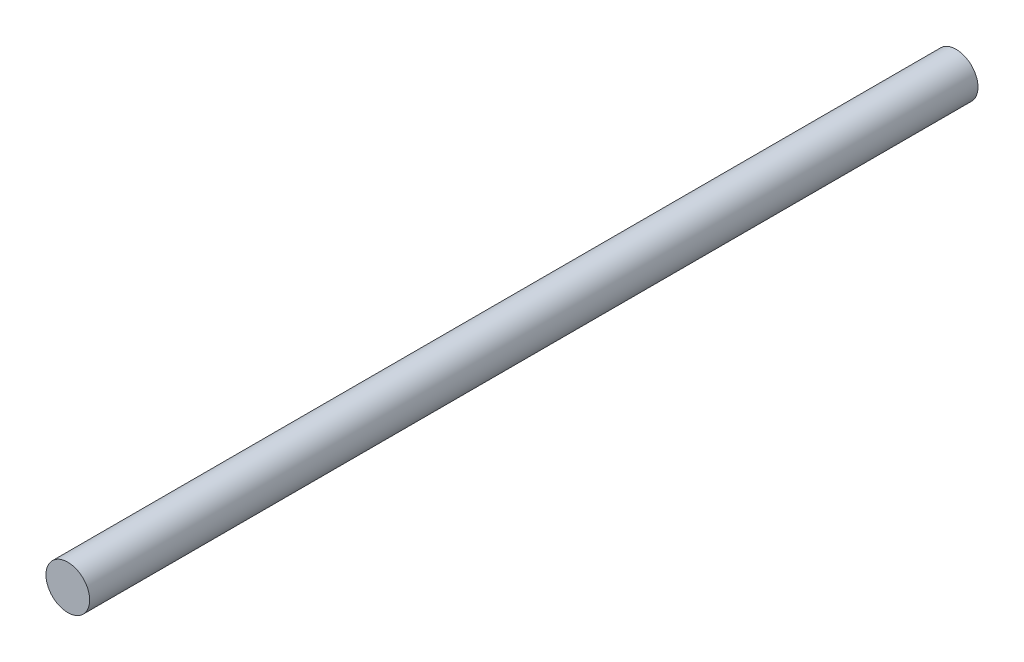
ISO-10303-21;
HEADER;
FILE_DESCRIPTION(('STEP AP214'),'2;1');
FILE_NAME('part.step','',(''),(''),'','','');
FILE_SCHEMA(('AUTOMOTIVE_DESIGN { 1 0 10303 214 1 1 1 1 }'));
ENDSEC;
DATA;
#1=APPLICATION_CONTEXT('core data for automotive mechanical design processes');
#2=APPLICATION_PROTOCOL_DEFINITION('international standard','automotive_design',2000,#1);
#3=PRODUCT_CONTEXT('',#1,'mechanical');
#4=PRODUCT('Part','Part','',(#3));
#5=PRODUCT_RELATED_PRODUCT_CATEGORY('part','',(#4));
#6=PRODUCT_DEFINITION_FORMATION('','',#4);
#7=PRODUCT_DEFINITION_CONTEXT('part definition',#1,'design');
#8=PRODUCT_DEFINITION('design','',#6,#7);
#9=PRODUCT_DEFINITION_SHAPE('','',#8);
#10=(LENGTH_UNIT() NAMED_UNIT(*) SI_UNIT(.MILLI.,.METRE.));
#11=(NAMED_UNIT(*) PLANE_ANGLE_UNIT() SI_UNIT($,.RADIAN.));
#12=(NAMED_UNIT(*) SI_UNIT($,.STERADIAN.) SOLID_ANGLE_UNIT());
#13=UNCERTAINTY_MEASURE_WITH_UNIT(LENGTH_MEASURE(1.E-05),#10,'distance_accuracy_value','');
#14=(GEOMETRIC_REPRESENTATION_CONTEXT(3) GLOBAL_UNCERTAINTY_ASSIGNED_CONTEXT((#13)) GLOBAL_UNIT_ASSIGNED_CONTEXT((#10,
#11,#12)) REPRESENTATION_CONTEXT('',''));
#15=CARTESIAN_POINT('',(0.,0.,0.));
#16=DIRECTION('',(0.,0.,1.));
#17=DIRECTION('',(1.,0.,0.));
#18=AXIS2_PLACEMENT_3D('',#15,#16,#17);
#19=CARTESIAN_POINT('',(0.,0.,67.05));
#20=DIRECTION('',(0.,0.,-1.));
#21=DIRECTION('',(-1.,0.,0.));
#22=AXIS2_PLACEMENT_3D('',#19,#20,#21);
#23=CYLINDRICAL_SURFACE('',#22,1.65);
#24=CARTESIAN_POINT('',(0.,0.,67.05));
#25=DIRECTION('',(0.,0.,1.));
#26=DIRECTION('',(1.,0.,0.));
#27=AXIS2_PLACEMENT_3D('',#24,#25,#26);
#28=CIRCLE('',#27,1.65);
#29=CARTESIAN_POINT('',(1.65,0.,67.05));
#30=VERTEX_POINT('',#29);
#31=EDGE_CURVE('E10',#30,#30,#28,.T.);
#32=ORIENTED_EDGE('',*,*,#31,.F.);
#33=EDGE_LOOP('',(#32));
#34=FACE_BOUND('',#33,.T.);
#35=CARTESIAN_POINT('',(0.,0.,0.));
#36=DIRECTION('',(0.,0.,1.));
#37=DIRECTION('',(1.,0.,0.));
#38=AXIS2_PLACEMENT_3D('',#35,#36,#37);
#39=CIRCLE('',#38,1.65);
#40=CARTESIAN_POINT('',(1.65,0.,0.));
#41=VERTEX_POINT('',#40);
#42=EDGE_CURVE('E40',#41,#41,#39,.T.);
#43=ORIENTED_EDGE('',*,*,#42,.T.);
#44=EDGE_LOOP('',(#43));
#45=FACE_BOUND('',#44,.T.);
#46=ADVANCED_FACE('F37',(#34,#45),#23,.T.);
#47=CARTESIAN_POINT('',(0.,0.,67.05));
#48=DIRECTION('',(0.,0.,1.));
#49=DIRECTION('',(1.,0.,0.));
#50=AXIS2_PLACEMENT_3D('',#47,#48,#49);
#51=PLANE('',#50);
#52=ORIENTED_EDGE('',*,*,#31,.T.);
#53=EDGE_LOOP('',(#52));
#54=FACE_BOUND('',#53,.T.);
#55=ADVANCED_FACE('F54',(#54),#51,.T.);
#56=CARTESIAN_POINT('',(0.,0.,0.));
#57=DIRECTION('',(0.,0.,1.));
#58=DIRECTION('',(1.,0.,0.));
#59=AXIS2_PLACEMENT_3D('',#56,#57,#58);
#60=PLANE('',#59);
#61=ORIENTED_EDGE('',*,*,#42,.F.);
#62=EDGE_LOOP('',(#61));
#63=FACE_BOUND('',#62,.T.);
#64=ADVANCED_FACE('F52',(#63),#60,.F.);
#65=CLOSED_SHELL('',(#46,#55,#64));
#66=MANIFOLD_SOLID_BREP('B2',#65);
#67=ADVANCED_BREP_SHAPE_REPRESENTATION('',(#18,#66),#14);
#68=SHAPE_DEFINITION_REPRESENTATION(#9,#67);
ENDSEC;
END-ISO-10303-21;
